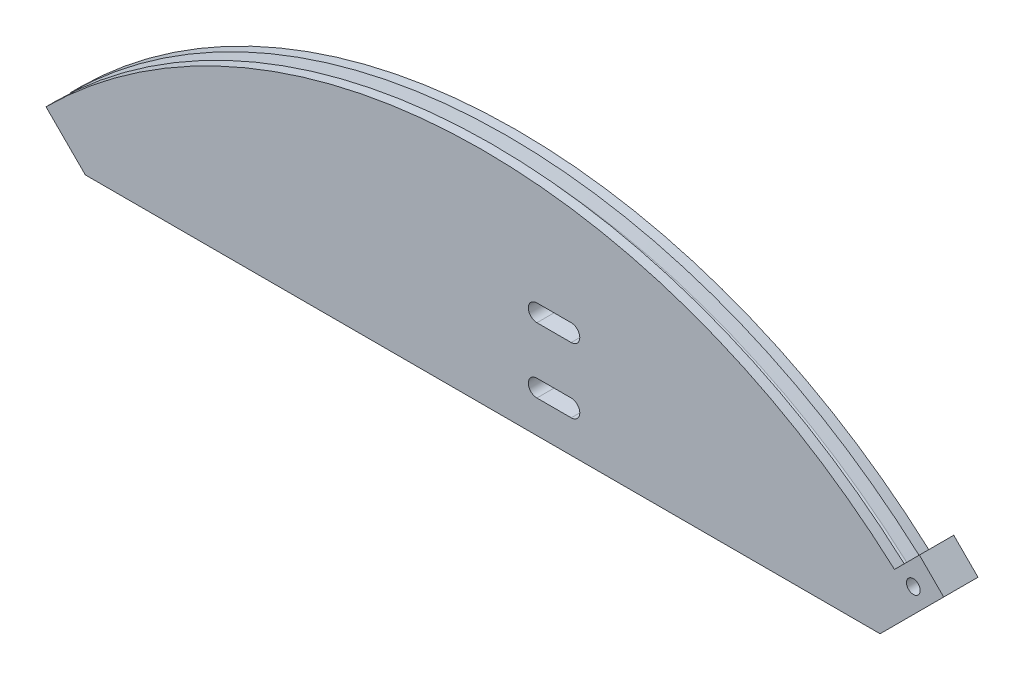
ISO-10303-21;
HEADER;
FILE_DESCRIPTION(('STEP AP214'),'2;1');
FILE_NAME('part.step','',(''),(''),'','','');
FILE_SCHEMA(('AUTOMOTIVE_DESIGN { 1 0 10303 214 1 1 1 1 }'));
ENDSEC;
DATA;
#1=APPLICATION_CONTEXT('core data for automotive mechanical design processes');
#2=APPLICATION_PROTOCOL_DEFINITION('international standard','automotive_design',2000,#1);
#3=PRODUCT_CONTEXT('',#1,'mechanical');
#4=PRODUCT('Part','Part','',(#3));
#5=PRODUCT_RELATED_PRODUCT_CATEGORY('part','',(#4));
#6=PRODUCT_DEFINITION_FORMATION('','',#4);
#7=PRODUCT_DEFINITION_CONTEXT('part definition',#1,'design');
#8=PRODUCT_DEFINITION('design','',#6,#7);
#9=PRODUCT_DEFINITION_SHAPE('','',#8);
#10=(LENGTH_UNIT() NAMED_UNIT(*) SI_UNIT(.MILLI.,.METRE.));
#11=(NAMED_UNIT(*) PLANE_ANGLE_UNIT() SI_UNIT($,.RADIAN.));
#12=(NAMED_UNIT(*) SI_UNIT($,.STERADIAN.) SOLID_ANGLE_UNIT());
#13=UNCERTAINTY_MEASURE_WITH_UNIT(LENGTH_MEASURE(1.E-05),#10,'distance_accuracy_value','');
#14=(GEOMETRIC_REPRESENTATION_CONTEXT(3) GLOBAL_UNCERTAINTY_ASSIGNED_CONTEXT((#13)) GLOBAL_UNIT_ASSIGNED_CONTEXT((#10,
#11,#12)) REPRESENTATION_CONTEXT('',''));
#15=CARTESIAN_POINT('',(0.,0.,0.));
#16=DIRECTION('',(0.,0.,1.));
#17=DIRECTION('',(1.,0.,0.));
#18=AXIS2_PLACEMENT_3D('',#15,#16,#17);
#19=CARTESIAN_POINT('',(0.,0.,5.));
#20=DIRECTION('',(0.,0.,-1.));
#21=DIRECTION('',(-1.,0.,0.));
#22=AXIS2_PLACEMENT_3D('',#19,#20,#21);
#23=CYLINDRICAL_SURFACE('',#22,180.);
#24=DIRECTION('',(0.,0.,-1.));
#25=VECTOR('',#24,1.);
#26=CARTESIAN_POINT('',(120.011582459523,134.153718083254,5.));
#27=LINE('',#26,#25);
#28=CARTESIAN_POINT('',(120.011582459523,134.153718083254,-5.));
#29=VERTEX_POINT('',#28);
#30=CARTESIAN_POINT('',(120.011582459523,134.153718083254,-2.15608847527453));
#31=VERTEX_POINT('',#30);
#32=EDGE_CURVE('E300',#29,#31,#27,.F.);
#33=ORIENTED_EDGE('',*,*,#32,.F.);
#34=CARTESIAN_POINT('',(0.,0.,-5.));
#35=DIRECTION('',(0.,0.,-1.));
#36=DIRECTION('',(-1.,0.,0.));
#37=AXIS2_PLACEMENT_3D('',#34,#35,#36);
#38=CIRCLE('',#37,180.);
#39=CARTESIAN_POINT('',(-127.279220613579,127.279220613578,-5.));
#40=VERTEX_POINT('',#39);
#41=EDGE_CURVE('E399',#40,#29,#38,.T.);
#42=ORIENTED_EDGE('',*,*,#41,.F.);
#43=DIRECTION('',(0.,0.,-1.));
#44=VECTOR('',#43,1.);
#45=CARTESIAN_POINT('',(-127.279220613579,127.279220613578,5.));
#46=LINE('',#45,#44);
#47=CARTESIAN_POINT('',(-127.279220613579,127.279220613578,-2.15608847527454));
#48=VERTEX_POINT('',#47);
#49=EDGE_CURVE('E384',#48,#40,#46,.T.);
#50=ORIENTED_EDGE('',*,*,#49,.F.);
#51=CARTESIAN_POINT('',(0.,0.,-2.15608847527454));
#52=DIRECTION('',(0.,0.,-1.));
#53=DIRECTION('',(-1.,0.,0.));
#54=AXIS2_PLACEMENT_3D('',#51,#52,#53);
#55=CIRCLE('',#54,180.);
#56=EDGE_CURVE('E411',#48,#31,#55,.T.);
#57=ORIENTED_EDGE('',*,*,#56,.T.);
#58=EDGE_LOOP('',(#33,#42,#50,#57));
#59=FACE_BOUND('',#58,.T.);
#60=ADVANCED_FACE('F32',(#59),#23,.T.);
#61=CARTESIAN_POINT('',(-120.208152801713,115.814760073381,5.));
#62=DIRECTION('',(0.,1.,0.));
#63=DIRECTION('',(0.,0.,1.));
#64=AXIS2_PLACEMENT_3D('',#61,#62,#63);
#65=PLANE('',#64);
#66=DIRECTION('',(0.,0.,-1.));
#67=VECTOR('',#66,1.);
#68=CARTESIAN_POINT('',(-115.814760073381,115.814760073381,5.));
#69=LINE('',#68,#67);
#70=CARTESIAN_POINT('',(-115.814760073381,115.814760073381,5.));
#71=VERTEX_POINT('',#70);
#72=CARTESIAN_POINT('',(-115.814760073381,115.814760073381,0.499999999999984));
#73=VERTEX_POINT('',#72);
#74=EDGE_CURVE('E234',#71,#73,#69,.T.);
#75=ORIENTED_EDGE('',*,*,#74,.T.);
#76=DIRECTION('',(1.,0.,0.));
#77=VECTOR('',#76,1.);
#78=CARTESIAN_POINT('',(115.814760073381,115.814760073381,0.500000000000028));
#79=LINE('',#78,#77);
#80=CARTESIAN_POINT('',(115.814760073381,115.814760073381,0.50000000000005));
#81=VERTEX_POINT('',#80);
#82=EDGE_CURVE('E344',#73,#81,#79,.T.);
#83=ORIENTED_EDGE('',*,*,#82,.T.);
#84=DIRECTION('',(0.,0.,1.));
#85=VECTOR('',#84,1.);
#86=CARTESIAN_POINT('',(115.814760073381,115.814760073381,5.));
#87=LINE('',#86,#85);
#88=CARTESIAN_POINT('',(115.814760073381,115.814760073381,5.));
#89=VERTEX_POINT('',#88);
#90=EDGE_CURVE('E239',#81,#89,#87,.T.);
#91=ORIENTED_EDGE('',*,*,#90,.T.);
#92=DIRECTION('',(1.,0.,0.));
#93=VECTOR('',#92,1.);
#94=CARTESIAN_POINT('',(-120.208152801713,115.814760073381,5.));
#95=LINE('',#94,#93);
#96=EDGE_CURVE('E346',#71,#89,#95,.T.);
#97=ORIENTED_EDGE('',*,*,#96,.F.);
#98=EDGE_LOOP('',(#75,#83,#91,#97));
#99=FACE_BOUND('',#98,.T.);
#100=ADVANCED_FACE('F331',(#99),#65,.F.);
#101=CARTESIAN_POINT('',(0.,0.,5.));
#102=DIRECTION('',(0.,0.,-1.));
#103=DIRECTION('',(-1.,0.,0.));
#104=AXIS2_PLACEMENT_3D('',#101,#102,#103);
#105=PLANE('',#104);
#106=DIRECTION('',(1.,0.,0.));
#107=VECTOR('',#106,1.);
#108=CARTESIAN_POINT('',(25.7911690817757,130.314760073381,5.));
#109=LINE('',#108,#107);
#110=CARTESIAN_POINT('',(15.7911690817757,130.314760073381,5.));
#111=VERTEX_POINT('',#110);
#112=CARTESIAN_POINT('',(25.7911690817757,130.314760073381,5.));
#113=VERTEX_POINT('',#112);
#114=EDGE_CURVE('E185',#111,#113,#109,.T.);
#115=ORIENTED_EDGE('',*,*,#114,.T.);
#116=CARTESIAN_POINT('',(25.7911690817757,127.814760073381,5.));
#117=DIRECTION('',(0.,0.,-1.));
#118=DIRECTION('',(-1.,0.,0.));
#119=AXIS2_PLACEMENT_3D('',#116,#117,#118);
#120=CIRCLE('',#119,2.5);
#121=CARTESIAN_POINT('',(25.7911690817757,125.314760073381,5.));
#122=VERTEX_POINT('',#121);
#123=EDGE_CURVE('E178',#113,#122,#120,.T.);
#124=ORIENTED_EDGE('',*,*,#123,.T.);
#125=DIRECTION('',(-1.,0.,0.));
#126=VECTOR('',#125,1.);
#127=CARTESIAN_POINT('',(25.7911690817757,125.314760073381,5.));
#128=LINE('',#127,#126);
#129=CARTESIAN_POINT('',(15.7911690817757,125.314760073381,5.));
#130=VERTEX_POINT('',#129);
#131=EDGE_CURVE('E189',#122,#130,#128,.T.);
#132=ORIENTED_EDGE('',*,*,#131,.T.);
#133=CARTESIAN_POINT('',(15.7911690817757,127.814760073381,5.));
#134=DIRECTION('',(0.,0.,-1.));
#135=DIRECTION('',(1.,0.,0.));
#136=AXIS2_PLACEMENT_3D('',#133,#134,#135);
#137=CIRCLE('',#136,2.5);
#138=EDGE_CURVE('E194',#130,#111,#137,.T.);
#139=ORIENTED_EDGE('',*,*,#138,.T.);
#140=EDGE_LOOP('',(#115,#124,#132,#139));
#141=FACE_BOUND('',#140,.T.);
#142=DIRECTION('',(-1.,0.,0.));
#143=VECTOR('',#142,1.);
#144=CARTESIAN_POINT('',(25.7911690817757,144.314760073381,5.));
#145=LINE('',#144,#143);
#146=CARTESIAN_POINT('',(25.7911690817757,144.314760073381,5.));
#147=VERTEX_POINT('',#146);
#148=CARTESIAN_POINT('',(15.7911690817757,144.314760073381,5.));
#149=VERTEX_POINT('',#148);
#150=EDGE_CURVE('E218',#147,#149,#145,.T.);
#151=ORIENTED_EDGE('',*,*,#150,.T.);
#152=CARTESIAN_POINT('',(15.7911690817757,146.814760073381,5.));
#153=DIRECTION('',(0.,0.,-1.));
#154=DIRECTION('',(-1.,0.,0.));
#155=AXIS2_PLACEMENT_3D('',#152,#153,#154);
#156=CIRCLE('',#155,2.5);
#157=CARTESIAN_POINT('',(15.7911690817757,149.314760073381,5.));
#158=VERTEX_POINT('',#157);
#159=EDGE_CURVE('E205',#149,#158,#156,.T.);
#160=ORIENTED_EDGE('',*,*,#159,.T.);
#161=DIRECTION('',(1.,0.,0.));
#162=VECTOR('',#161,1.);
#163=CARTESIAN_POINT('',(25.7911690817757,149.314760073381,5.));
#164=LINE('',#163,#162);
#165=CARTESIAN_POINT('',(25.7911690817757,149.314760073381,5.));
#166=VERTEX_POINT('',#165);
#167=EDGE_CURVE('E212',#158,#166,#164,.T.);
#168=ORIENTED_EDGE('',*,*,#167,.T.);
#169=CARTESIAN_POINT('',(25.7911690817757,146.814760073381,5.));
#170=DIRECTION('',(0.,0.,-1.));
#171=DIRECTION('',(1.,0.,0.));
#172=AXIS2_PLACEMENT_3D('',#169,#170,#171);
#173=CIRCLE('',#172,2.5);
#174=EDGE_CURVE('E215',#166,#147,#173,.T.);
#175=ORIENTED_EDGE('',*,*,#174,.T.);
#176=EDGE_LOOP('',(#151,#160,#168,#175));
#177=FACE_BOUND('',#176,.T.);
#178=DIRECTION('',(-0.707106781186549,0.707106781186546,0.));
#179=VECTOR('',#178,1.);
#180=CARTESIAN_POINT('',(-127.279220613579,127.279220613578,5.));
#181=LINE('',#180,#179);
#182=CARTESIAN_POINT('',(-127.279220613579,127.279220613578,5.));
#183=VERTEX_POINT('',#182);
#184=EDGE_CURVE('E395',#71,#183,#181,.T.);
#185=ORIENTED_EDGE('',*,*,#184,.F.);
#186=ORIENTED_EDGE('',*,*,#96,.T.);
#187=DIRECTION('',(-0.707106781186548,-0.707106781186547,0.));
#188=VECTOR('',#187,1.);
#189=CARTESIAN_POINT('',(127.279220613579,127.279220613578,5.));
#190=LINE('',#189,#188);
#191=CARTESIAN_POINT('',(134.350288425444,134.350288425444,5.));
#192=VERTEX_POINT('',#191);
#193=EDGE_CURVE('E385',#192,#89,#190,.T.);
#194=ORIENTED_EDGE('',*,*,#193,.F.);
#195=DIRECTION('',(0.707106781186547,-0.707106781186547,0.));
#196=VECTOR('',#195,1.);
#197=CARTESIAN_POINT('',(134.350288425444,134.350288425444,5.));
#198=LINE('',#197,#196);
#199=CARTESIAN_POINT('',(127.279220613579,141.421356237309,5.));
#200=VERTEX_POINT('',#199);
#201=EDGE_CURVE('E254',#200,#192,#198,.T.);
#202=ORIENTED_EDGE('',*,*,#201,.F.);
#203=DIRECTION('',(0.707106781186547,0.707106781186548,0.));
#204=VECTOR('',#203,1.);
#205=CARTESIAN_POINT('',(127.279220613579,141.421356237309,5.));
#206=LINE('',#205,#204);
#207=CARTESIAN_POINT('',(120.011582459523,134.153718083254,5.));
#208=VERTEX_POINT('',#207);
#209=EDGE_CURVE('E252',#208,#200,#206,.T.);
#210=ORIENTED_EDGE('',*,*,#209,.F.);
#211=CARTESIAN_POINT('',(0.,0.,5.));
#212=DIRECTION('',(0.,0.,-1.));
#213=DIRECTION('',(-1.,0.,0.));
#214=AXIS2_PLACEMENT_3D('',#211,#212,#213);
#215=CIRCLE('',#214,180.);
#216=EDGE_CURVE('E392',#183,#208,#215,.T.);
#217=ORIENTED_EDGE('',*,*,#216,.F.);
#218=EDGE_LOOP('',(#185,#186,#194,#202,#210,#217));
#219=FACE_BOUND('',#218,.T.);
#220=CARTESIAN_POINT('',(125.511453660612,132.582521472477,5.));
#221=DIRECTION('',(0.,0.,-1.));
#222=DIRECTION('',(-1.,0.,0.));
#223=AXIS2_PLACEMENT_3D('',#220,#221,#222);
#224=CIRCLE('',#223,2.);
#225=CARTESIAN_POINT('',(123.511453660612,132.582521472477,5.));
#226=VERTEX_POINT('',#225);
#227=EDGE_CURVE('E249',#226,#226,#224,.T.);
#228=ORIENTED_EDGE('',*,*,#227,.T.);
#229=EDGE_LOOP('',(#228));
#230=FACE_BOUND('',#229,.T.);
#231=ADVANCED_FACE('F196',(#141,#177,#219,#230),#105,.F.);
#232=CARTESIAN_POINT('',(0.,0.,0.));
#233=DIRECTION('',(0.,0.,-1.));
#234=DIRECTION('',(-1.,0.,0.));
#235=AXIS2_PLACEMENT_3D('',#232,#233,#234);
#236=PLANE('',#235);
#237=CARTESIAN_POINT('',(25.7911690817757,127.814760073381,0.));
#238=DIRECTION('',(0.,0.,-1.));
#239=DIRECTION('',(-1.,0.,0.));
#240=AXIS2_PLACEMENT_3D('',#237,#238,#239);
#241=CIRCLE('',#240,2.5);
#242=CARTESIAN_POINT('',(25.7911690817757,130.314760073381,0.));
#243=VERTEX_POINT('',#242);
#244=CARTESIAN_POINT('',(25.7911690817757,125.314760073381,0.));
#245=VERTEX_POINT('',#244);
#246=EDGE_CURVE('E181',#243,#245,#241,.T.);
#247=ORIENTED_EDGE('',*,*,#246,.F.);
#248=DIRECTION('',(1.,0.,0.));
#249=VECTOR('',#248,1.);
#250=CARTESIAN_POINT('',(0.,130.314760073381,0.));
#251=LINE('',#250,#249);
#252=CARTESIAN_POINT('',(15.7911690817757,130.314760073381,0.));
#253=VERTEX_POINT('',#252);
#254=EDGE_CURVE('E352',#253,#243,#251,.T.);
#255=ORIENTED_EDGE('',*,*,#254,.F.);
#256=CARTESIAN_POINT('',(15.7911690817757,127.814760073381,0.));
#257=DIRECTION('',(0.,0.,-1.));
#258=DIRECTION('',(-1.,0.,0.));
#259=AXIS2_PLACEMENT_3D('',#256,#257,#258);
#260=CIRCLE('',#259,2.5);
#261=CARTESIAN_POINT('',(15.7911690817757,125.314760073381,0.));
#262=VERTEX_POINT('',#261);
#263=EDGE_CURVE('E356',#262,#253,#260,.T.);
#264=ORIENTED_EDGE('',*,*,#263,.F.);
#265=DIRECTION('',(-1.,0.,0.));
#266=VECTOR('',#265,1.);
#267=CARTESIAN_POINT('',(0.,125.314760073381,0.));
#268=LINE('',#267,#266);
#269=EDGE_CURVE('E358',#245,#262,#268,.T.);
#270=ORIENTED_EDGE('',*,*,#269,.F.);
#271=EDGE_LOOP('',(#247,#255,#264,#270));
#272=FACE_BOUND('',#271,.T.);
#273=CARTESIAN_POINT('',(15.7911690817757,146.814760073381,0.));
#274=DIRECTION('',(0.,0.,-1.));
#275=DIRECTION('',(-1.,0.,0.));
#276=AXIS2_PLACEMENT_3D('',#273,#274,#275);
#277=CIRCLE('',#276,2.5);
#278=CARTESIAN_POINT('',(15.7911690817757,144.314760073381,0.));
#279=VERTEX_POINT('',#278);
#280=CARTESIAN_POINT('',(15.7911690817757,149.314760073381,0.));
#281=VERTEX_POINT('',#280);
#282=EDGE_CURVE('E360',#279,#281,#277,.T.);
#283=ORIENTED_EDGE('',*,*,#282,.F.);
#284=DIRECTION('',(-1.,0.,0.));
#285=VECTOR('',#284,1.);
#286=CARTESIAN_POINT('',(0.,144.314760073381,0.));
#287=LINE('',#286,#285);
#288=CARTESIAN_POINT('',(25.7911690817757,144.314760073381,0.));
#289=VERTEX_POINT('',#288);
#290=EDGE_CURVE('E363',#289,#279,#287,.T.);
#291=ORIENTED_EDGE('',*,*,#290,.F.);
#292=CARTESIAN_POINT('',(25.7911690817757,146.814760073381,0.));
#293=DIRECTION('',(0.,0.,-1.));
#294=DIRECTION('',(-1.,0.,0.));
#295=AXIS2_PLACEMENT_3D('',#292,#293,#294);
#296=CIRCLE('',#295,2.5);
#297=CARTESIAN_POINT('',(25.7911690817757,149.314760073381,0.));
#298=VERTEX_POINT('',#297);
#299=EDGE_CURVE('E365',#298,#289,#296,.T.);
#300=ORIENTED_EDGE('',*,*,#299,.F.);
#301=DIRECTION('',(1.,0.,0.));
#302=VECTOR('',#301,1.);
#303=CARTESIAN_POINT('',(0.,149.314760073381,0.));
#304=LINE('',#303,#302);
#305=EDGE_CURVE('E366',#281,#298,#304,.T.);
#306=ORIENTED_EDGE('',*,*,#305,.F.);
#307=EDGE_LOOP('',(#283,#291,#300,#306));
#308=FACE_BOUND('',#307,.T.);
#309=DIRECTION('',(0.707106781186548,0.707106781186547,0.));
#310=VECTOR('',#309,1.);
#311=CARTESIAN_POINT('',(0.,0.,0.));
#312=LINE('',#311,#310);
#313=CARTESIAN_POINT('',(116.314760073381,116.314760073381,0.));
#314=VERTEX_POINT('',#313);
#315=CARTESIAN_POINT('',(120.208152801713,120.208152801713,0.));
#316=VERTEX_POINT('',#315);
#317=EDGE_CURVE('E237',#314,#316,#312,.T.);
#318=ORIENTED_EDGE('',*,*,#317,.F.);
#319=DIRECTION('',(-1.,0.,0.));
#320=VECTOR('',#319,1.);
#321=CARTESIAN_POINT('',(-115.814760073381,116.314760073381,0.));
#322=LINE('',#321,#320);
#323=CARTESIAN_POINT('',(-116.314760073381,116.314760073381,0.));
#324=VERTEX_POINT('',#323);
#325=EDGE_CURVE('E40',#314,#324,#322,.T.);
#326=ORIENTED_EDGE('',*,*,#325,.T.);
#327=DIRECTION('',(0.707106781186546,-0.707106781186549,0.));
#328=VECTOR('',#327,1.);
#329=CARTESIAN_POINT('',(-4.51401581871586E-13,-4.51401581871585E-13,0.));
#330=LINE('',#329,#328);
#331=CARTESIAN_POINT('',(-120.208152801713,120.208152801713,0.));
#332=VERTEX_POINT('',#331);
#333=EDGE_CURVE('E225',#332,#324,#330,.T.);
#334=ORIENTED_EDGE('',*,*,#333,.F.);
#335=CARTESIAN_POINT('',(0.,0.,0.));
#336=DIRECTION('',(0.,0.,1.));
#337=DIRECTION('',(-1.,0.,0.));
#338=AXIS2_PLACEMENT_3D('',#335,#336,#337);
#339=CIRCLE('',#338,170.);
#340=EDGE_CURVE('E375',#316,#332,#339,.T.);
#341=ORIENTED_EDGE('',*,*,#340,.F.);
#342=EDGE_LOOP('',(#318,#326,#334,#341));
#343=FACE_BOUND('',#342,.T.);
#344=ADVANCED_FACE('F327',(#272,#308,#343),#236,.T.);
#345=CARTESIAN_POINT('',(0.,0.,5.));
#346=DIRECTION('',(0.,0.,-1.));
#347=DIRECTION('',(-1.,0.,0.));
#348=AXIS2_PLACEMENT_3D('',#345,#346,#347);
#349=CYLINDRICAL_SURFACE('',#348,170.);
#350=DIRECTION('',(0.,0.,-1.));
#351=VECTOR('',#350,1.);
#352=CARTESIAN_POINT('',(120.208152801713,120.208152801713,5.));
#353=LINE('',#352,#351);
#354=CARTESIAN_POINT('',(120.208152801713,120.208152801713,-5.));
#355=VERTEX_POINT('',#354);
#356=EDGE_CURVE('E380',#316,#355,#353,.T.);
#357=ORIENTED_EDGE('',*,*,#356,.F.);
#358=ORIENTED_EDGE('',*,*,#340,.T.);
#359=DIRECTION('',(0.,0.,-1.));
#360=VECTOR('',#359,1.);
#361=CARTESIAN_POINT('',(-120.208152801713,120.208152801713,5.));
#362=LINE('',#361,#360);
#363=CARTESIAN_POINT('',(-120.208152801713,120.208152801713,-5.));
#364=VERTEX_POINT('',#363);
#365=EDGE_CURVE('E382',#332,#364,#362,.T.);
#366=ORIENTED_EDGE('',*,*,#365,.T.);
#367=CARTESIAN_POINT('',(0.,0.,-5.));
#368=DIRECTION('',(0.,0.,1.));
#369=DIRECTION('',(-1.,0.,0.));
#370=AXIS2_PLACEMENT_3D('',#367,#368,#369);
#371=CIRCLE('',#370,170.);
#372=EDGE_CURVE('E405',#355,#364,#371,.T.);
#373=ORIENTED_EDGE('',*,*,#372,.F.);
#374=EDGE_LOOP('',(#357,#358,#366,#373));
#375=FACE_BOUND('',#374,.T.);
#376=ADVANCED_FACE('F318',(#375),#349,.F.);
#377=CARTESIAN_POINT('',(127.279220613579,127.279220613578,5.));
#378=DIRECTION('',(0.707106781186547,-0.707106781186548,0.));
#379=DIRECTION('',(0.707106781186548,0.707106781186547,0.));
#380=AXIS2_PLACEMENT_3D('',#377,#378,#379);
#381=PLANE('',#380);
#382=ORIENTED_EDGE('',*,*,#90,.F.);
#383=DIRECTION('',(0.577350269189616,0.577350269189615,-0.577350269189647));
#384=VECTOR('',#383,1.);
#385=CARTESIAN_POINT('',(121.957733766846,121.957733766846,-5.642973693465));
#386=LINE('',#385,#384);
#387=EDGE_CURVE('E54',#81,#314,#386,.T.);
#388=ORIENTED_EDGE('',*,*,#387,.T.);
#389=ORIENTED_EDGE('',*,*,#317,.T.);
#390=ORIENTED_EDGE('',*,*,#356,.T.);
#391=DIRECTION('',(-0.707106781186548,-0.707106781186547,0.));
#392=VECTOR('',#391,1.);
#393=CARTESIAN_POINT('',(127.279220613579,127.279220613578,-5.));
#394=LINE('',#393,#392);
#395=CARTESIAN_POINT('',(134.350288425444,134.350288425444,-5.));
#396=VERTEX_POINT('',#395);
#397=EDGE_CURVE('E397',#396,#355,#394,.T.);
#398=ORIENTED_EDGE('',*,*,#397,.F.);
#399=DIRECTION('',(0.,0.,-1.));
#400=VECTOR('',#399,1.);
#401=CARTESIAN_POINT('',(134.350288425444,134.350288425444,5.));
#402=LINE('',#401,#400);
#403=EDGE_CURVE('E258',#192,#396,#402,.T.);
#404=ORIENTED_EDGE('',*,*,#403,.F.);
#405=ORIENTED_EDGE('',*,*,#193,.T.);
#406=EDGE_LOOP('',(#382,#388,#389,#390,#398,#404,#405));
#407=FACE_BOUND('',#406,.T.);
#408=ADVANCED_FACE('F314',(#407),#381,.T.);
#409=DIRECTION('',(0.,0.,-1.));
#410=VECTOR('',#409,1.);
#411=CARTESIAN_POINT('',(120.011582459523,134.153718083254,5.));
#412=LINE('',#411,#410);
#413=CARTESIAN_POINT('',(120.011582459523,134.153718083254,2.15608847527453));
#414=VERTEX_POINT('',#413);
#415=EDGE_CURVE('E271',#414,#208,#412,.F.);
#416=ORIENTED_EDGE('',*,*,#415,.F.);
#417=CARTESIAN_POINT('',(0.,0.,2.15608847527454));
#418=DIRECTION('',(0.,0.,-1.));
#419=DIRECTION('',(-1.,0.,0.));
#420=AXIS2_PLACEMENT_3D('',#417,#418,#419);
#421=CIRCLE('',#420,180.);
#422=CARTESIAN_POINT('',(-127.279220613579,127.279220613578,2.15608847527454));
#423=VERTEX_POINT('',#422);
#424=EDGE_CURVE('E414',#423,#414,#421,.T.);
#425=ORIENTED_EDGE('',*,*,#424,.F.);
#426=EDGE_CURVE('E386',#183,#423,#46,.T.);
#427=ORIENTED_EDGE('',*,*,#426,.F.);
#428=ORIENTED_EDGE('',*,*,#216,.T.);
#429=EDGE_LOOP('',(#416,#425,#427,#428));
#430=FACE_BOUND('',#429,.T.);
#431=ADVANCED_FACE('F317',(#430),#23,.T.);
#432=CARTESIAN_POINT('',(-127.279220613579,127.279220613578,5.));
#433=DIRECTION('',(-0.707106781186546,-0.707106781186549,0.));
#434=DIRECTION('',(0.707106781186549,-0.707106781186546,0.));
#435=AXIS2_PLACEMENT_3D('',#432,#433,#434);
#436=PLANE('',#435);
#437=ORIENTED_EDGE('',*,*,#333,.T.);
#438=DIRECTION('',(0.577350269189617,-0.577350269189614,0.577350269189646));
#439=VECTOR('',#438,1.);
#440=CARTESIAN_POINT('',(-121.957733766846,121.957733766846,-5.64297369346503));
#441=LINE('',#440,#439);
#442=EDGE_CURVE('E11',#324,#73,#441,.T.);
#443=ORIENTED_EDGE('',*,*,#442,.T.);
#444=ORIENTED_EDGE('',*,*,#74,.F.);
#445=ORIENTED_EDGE('',*,*,#184,.T.);
#446=ORIENTED_EDGE('',*,*,#426,.T.);
#447=DIRECTION('',(0.664463024388677,-0.664463024388672,-0.342020143325671));
#448=VECTOR('',#447,1.);
#449=CARTESIAN_POINT('',(-124.916055507371,124.916055507371,0.939692620785907));
#450=LINE('',#449,#448);
#451=CARTESIAN_POINT('',(-124.916055507371,124.916055507371,0.939692620785859));
#452=VERTEX_POINT('',#451);
#453=EDGE_CURVE('E418',#423,#452,#450,.T.);
#454=ORIENTED_EDGE('',*,*,#453,.T.);
#455=CARTESIAN_POINT('',(-125.157900270019,125.157900270019,0.));
#456=DIRECTION('',(0.707106781186545,0.70710678118655,0.));
#457=DIRECTION('',(-0.70710678118655,0.707106781186545,0.));
#458=AXIS2_PLACEMENT_3D('',#455,#456,#457);
#459=CIRCLE('',#458,1.);
#460=CARTESIAN_POINT('',(-124.916055507371,124.916055507371,-0.939692620785907));
#461=VERTEX_POINT('',#460);
#462=EDGE_CURVE('E423',#452,#461,#459,.T.);
#463=ORIENTED_EDGE('',*,*,#462,.T.);
#464=DIRECTION('',(-0.664463024388677,0.664463024388672,-0.342020143325671));
#465=VECTOR('',#464,1.);
#466=CARTESIAN_POINT('',(-124.916055507371,124.916055507371,-0.939692620785907));
#467=LINE('',#466,#465);
#468=EDGE_CURVE('E421',#461,#48,#467,.T.);
#469=ORIENTED_EDGE('',*,*,#468,.T.);
#470=ORIENTED_EDGE('',*,*,#49,.T.);
#471=DIRECTION('',(-0.707106781186549,0.707106781186546,0.));
#472=VECTOR('',#471,1.);
#473=CARTESIAN_POINT('',(-127.279220613579,127.279220613578,-5.));
#474=LINE('',#473,#472);
#475=EDGE_CURVE('E402',#364,#40,#474,.T.);
#476=ORIENTED_EDGE('',*,*,#475,.F.);
#477=ORIENTED_EDGE('',*,*,#365,.F.);
#478=EDGE_LOOP('',(#437,#443,#444,#445,#446,#454,#463,#469,#470,#476,#477));
#479=FACE_BOUND('',#478,.T.);
#480=ADVANCED_FACE('F312',(#479),#436,.T.);
#481=CARTESIAN_POINT('',(0.,0.,-5.));
#482=DIRECTION('',(0.,0.,-1.));
#483=DIRECTION('',(-1.,0.,0.));
#484=AXIS2_PLACEMENT_3D('',#481,#482,#483);
#485=PLANE('',#484);
#486=ORIENTED_EDGE('',*,*,#397,.T.);
#487=ORIENTED_EDGE('',*,*,#372,.T.);
#488=ORIENTED_EDGE('',*,*,#475,.T.);
#489=ORIENTED_EDGE('',*,*,#41,.T.);
#490=DIRECTION('',(0.707106781186547,0.707106781186548,0.));
#491=VECTOR('',#490,1.);
#492=CARTESIAN_POINT('',(127.279220613579,141.421356237309,-5.));
#493=LINE('',#492,#491);
#494=CARTESIAN_POINT('',(127.279220613579,141.421356237309,-5.));
#495=VERTEX_POINT('',#494);
#496=EDGE_CURVE('E244',#29,#495,#493,.T.);
#497=ORIENTED_EDGE('',*,*,#496,.T.);
#498=DIRECTION('',(0.707106781186547,-0.707106781186547,0.));
#499=VECTOR('',#498,1.);
#500=CARTESIAN_POINT('',(134.350288425444,134.350288425444,-5.));
#501=LINE('',#500,#499);
#502=EDGE_CURVE('E246',#495,#396,#501,.T.);
#503=ORIENTED_EDGE('',*,*,#502,.T.);
#504=EDGE_LOOP('',(#486,#487,#488,#489,#497,#503));
#505=FACE_BOUND('',#504,.T.);
#506=CARTESIAN_POINT('',(125.511453660612,132.582521472477,-5.));
#507=DIRECTION('',(0.,0.,-1.));
#508=DIRECTION('',(-1.,0.,0.));
#509=AXIS2_PLACEMENT_3D('',#506,#507,#508);
#510=CIRCLE('',#509,2.);
#511=CARTESIAN_POINT('',(123.511453660612,132.582521472477,-5.));
#512=VERTEX_POINT('',#511);
#513=EDGE_CURVE('E241',#512,#512,#510,.T.);
#514=ORIENTED_EDGE('',*,*,#513,.F.);
#515=EDGE_LOOP('',(#514));
#516=FACE_BOUND('',#515,.T.);
#517=ADVANCED_FACE('F309',(#505,#516),#485,.T.);
#518=CARTESIAN_POINT('',(0.,0.,0.));
#519=DIRECTION('',(0.,0.,-1.));
#520=DIRECTION('',(-1.,0.,0.));
#521=AXIS2_PLACEMENT_3D('',#518,#519,#520);
#522=TOROIDAL_SURFACE('',#521,177.,1.);
#523=CARTESIAN_POINT('',(0.,0.,0.939692620785907));
#524=DIRECTION('',(0.,0.,-1.));
#525=DIRECTION('',(-1.,0.,0.));
#526=AXIS2_PLACEMENT_3D('',#523,#524,#525);
#527=CIRCLE('',#526,176.657979856674);
#528=CARTESIAN_POINT('',(117.644692713902,131.786828337633,0.939692620785907));
#529=VERTEX_POINT('',#528);
#530=EDGE_CURVE('E416',#452,#529,#527,.T.);
#531=ORIENTED_EDGE('',*,*,#530,.T.);
#532=CARTESIAN_POINT('',(117.736189385021,131.878325008751,0.977088887740852));
#533=CARTESIAN_POINT('',(117.720743711273,131.862879335003,0.972337446076096));
#534=CARTESIAN_POINT('',(117.70541715424,131.84755277797,0.966859335297035));
#535=CARTESIAN_POINT('',(117.675029324941,131.817164948672,0.954457009780921));
#536=CARTESIAN_POINT('',(117.659968584641,131.802104208372,0.947530188480028));
#537=CARTESIAN_POINT('',(117.607695170556,131.749830794286,0.920710853752846));
#538=CARTESIAN_POINT('',(117.571408150486,131.713543774217,0.897045952447444));
#539=CARTESIAN_POINT('',(117.502134252597,131.644269876328,0.841423904502413));
#540=CARTESIAN_POINT('',(117.469151517007,131.611287140738,0.809456525811238));
#541=CARTESIAN_POINT('',(117.407460771669,131.549596395399,0.738149931253692));
#542=CARTESIAN_POINT('',(117.378750886905,131.520886510635,0.698813966093187));
#543=CARTESIAN_POINT('',(117.326423304531,131.468558928261,0.613887424252139));
#544=CARTESIAN_POINT('',(117.302804365015,131.444939988745,0.568298377423894));
#545=CARTESIAN_POINT('',(117.261345496523,131.403481120253,0.472200144939431));
#546=CARTESIAN_POINT('',(117.243499720927,131.385635344657,0.421696004789447));
#547=CARTESIAN_POINT('',(117.214066293569,131.3562019173,0.317161663553523));
#548=CARTESIAN_POINT('',(117.202478799558,131.344614423289,0.263131373623646));
#549=CARTESIAN_POINT('',(117.185907568773,131.328043192503,0.153163711140857));
#550=CARTESIAN_POINT('',(117.180914324772,131.323049948502,0.0972292036822494));
#551=CARTESIAN_POINT('',(117.177643851616,131.319779475347,-0.0150316569611994));
#552=CARTESIAN_POINT('',(117.179366666525,131.321502290255,-0.0713580127144703));
#553=CARTESIAN_POINT('',(117.189475667336,131.331611291066,-0.182765033555946));
#554=CARTESIAN_POINT('',(117.197857601848,131.339993225579,-0.23784647037211));
#555=CARTESIAN_POINT('',(117.221038408929,131.363174032659,-0.345233103150092));
#556=CARTESIAN_POINT('',(117.235836653165,131.377972276895,-0.397538570392143));
#557=CARTESIAN_POINT('',(117.271428974139,131.413564597869,-0.497905433094977));
#558=CARTESIAN_POINT('',(117.29222394298,131.43435956671,-0.54596619570147));
#559=CARTESIAN_POINT('',(117.339230209192,131.481365832922,-0.636502316631662));
#560=CARTESIAN_POINT('',(117.365444367658,131.507579991388,-0.678974705075093));
#561=CARTESIAN_POINT('',(117.422590116493,131.564725740223,-0.757187916302949));
#562=CARTESIAN_POINT('',(117.45353175251,131.59566737624,-0.792914033335121));
#563=CARTESIAN_POINT('',(117.519161821393,131.661297445123,-0.856451482272249));
#564=CARTESIAN_POINT('',(117.553841326431,131.695976950161,-0.88428112103348));
#565=CARTESIAN_POINT('',(117.607953068897,131.750088692627,-0.919588025912723));
#566=CARTESIAN_POINT('',(117.626369502201,131.768505125932,-0.930295745185527));
#567=CARTESIAN_POINT('',(117.682525913384,131.824661537115,-0.959095697818133));
#568=CARTESIAN_POINT('',(117.721155970288,131.863291594018,-0.973851081195405));
#569=CARTESIAN_POINT('',(117.799666286683,131.941801910414,-0.993980922150626));
#570=CARTESIAN_POINT('',(117.839547905156,131.981683528886,-0.999344796228181));
#571=CARTESIAN_POINT('',(117.893531356586,132.035666980317,-1.00015586628561));
#572=CARTESIAN_POINT('',(117.907642708815,132.049778332545,-0.999770920045031));
#573=CARTESIAN_POINT('',(117.93578357875,132.077919202481,-0.997814936710401));
#574=CARTESIAN_POINT('',(117.949813215094,132.091948838824,-0.996247314563025));
#575=CARTESIAN_POINT('',(117.963803196566,132.105938820296,-0.994091159150351));
#576=B_SPLINE_CURVE_WITH_KNOTS('',3,(#532,#533,#534,#535,#536,#537,#538,#539,#540,#541,#542,
#543,#544,#545,#546,#547,#548,#549,#550,#551,#552,#553,#554,#555,#556,#557,#558,#559,#560,#561,
#562,#563,#564,#565,#566,#567,#568,#569,#570,#571,#572,#573,#574,#575),.UNSPECIFIED.,.F.,.F.,(4,
2,2,2,2,2,2,2,2,2,2,2,2,2,2,2,2,2,2,2,2,4),(0.,0.0670300250693148,0.134181706404661,
0.302833292476237,0.471693720863738,0.640479829928815,0.809224717917413,0.977798175049171,
1.14637588115418,1.31471027491706,1.48304577309525,1.65127388690369,1.81948553031732,
1.98772221066412,2.15604794051112,2.32473646063794,2.49303064412905,2.57744209012514,
2.74634700974852,2.91544214986125,2.97529536297636,3.03497640977476),.UNSPECIFIED.);
#577=CARTESIAN_POINT('',(117.644692713902,131.786828337633,-0.939692620785893));
#578=VERTEX_POINT('',#577);
#579=EDGE_CURVE('E261',#529,#578,#576,.T.);
#580=ORIENTED_EDGE('',*,*,#579,.T.);
#581=CARTESIAN_POINT('',(0.,0.,-0.939692620785907));
#582=DIRECTION('',(0.,0.,-1.));
#583=DIRECTION('',(-1.,0.,0.));
#584=AXIS2_PLACEMENT_3D('',#581,#582,#583);
#585=CIRCLE('',#584,176.657979856674);
#586=EDGE_CURVE('E408',#461,#578,#585,.T.);
#587=ORIENTED_EDGE('',*,*,#586,.F.);
#588=ORIENTED_EDGE('',*,*,#462,.F.);
#589=EDGE_LOOP('',(#531,#580,#587,#588));
#590=FACE_BOUND('',#589,.T.);
#591=ADVANCED_FACE('F273',(#590),#522,.F.);
#592=CARTESIAN_POINT('',(0.,0.,-0.939692620785907));
#593=DIRECTION('',(0.,0.,-1.));
#594=DIRECTION('',(-1.,0.,0.));
#595=AXIS2_PLACEMENT_3D('',#592,#593,#594);
#596=CONICAL_SURFACE('',#595,176.657979856674,1.22173047639603);
#597=ORIENTED_EDGE('',*,*,#586,.T.);
#598=CARTESIAN_POINT('',(117.644303537898,131.786439161629,-0.939492620785907));
#599=CARTESIAN_POINT('',(118.038916244884,132.181051868614,-1.14228663249949));
#600=CARTESIAN_POINT('',(118.433528271261,132.575663894991,-1.34508329289702));
#601=CARTESIAN_POINT('',(119.222750962799,133.364886586529,-1.75068191105991));
#602=CARTESIAN_POINT('',(119.61736162796,133.75949725169,-1.95348386882526));
#603=CARTESIAN_POINT('',(120.011971612513,134.154107236243,-2.15628847527456));
#604=B_SPLINE_CURVE_WITH_KNOTS('',3,(#598,#599,#600,#601,#602,#603),.UNSPECIFIED.,.F.,.F.,(4,2,
4),(0.,1.78131246380947,3.56262492761818),.UNSPECIFIED.);
#605=EDGE_CURVE('E293',#578,#31,#604,.T.);
#606=ORIENTED_EDGE('',*,*,#605,.T.);
#607=ORIENTED_EDGE('',*,*,#56,.F.);
#608=ORIENTED_EDGE('',*,*,#468,.F.);
#609=EDGE_LOOP('',(#597,#606,#607,#608));
#610=FACE_BOUND('',#609,.T.);
#611=ADVANCED_FACE('F302',(#610),#596,.T.);
#612=CARTESIAN_POINT('',(0.,0.,2.15608847527454));
#613=DIRECTION('',(0.,0.,1.));
#614=DIRECTION('',(1.,0.,0.));
#615=AXIS2_PLACEMENT_3D('',#612,#613,#614);
#616=CONICAL_SURFACE('',#615,180.,1.22173047639603);
#617=ORIENTED_EDGE('',*,*,#424,.T.);
#618=CARTESIAN_POINT('',(120.011971612513,134.154107236243,2.15628847527455));
#619=CARTESIAN_POINT('',(119.61736162796,133.75949725169,1.95348386882525));
#620=CARTESIAN_POINT('',(119.222750962799,133.364886586529,1.75068191105991));
#621=CARTESIAN_POINT('',(118.433528271261,132.575663894991,1.34508329289702));
#622=CARTESIAN_POINT('',(118.038916244884,132.181051868614,1.14228663249949));
#623=CARTESIAN_POINT('',(117.644303537898,131.786439161629,0.939492620785907));
#624=B_SPLINE_CURVE_WITH_KNOTS('',3,(#618,#619,#620,#621,#622,#623),.UNSPECIFIED.,.F.,.F.,(4,2,
4),(0.,1.78131246380871,3.56262492761818),.UNSPECIFIED.);
#625=EDGE_CURVE('E287',#414,#529,#624,.T.);
#626=ORIENTED_EDGE('',*,*,#625,.T.);
#627=ORIENTED_EDGE('',*,*,#530,.F.);
#628=ORIENTED_EDGE('',*,*,#453,.F.);
#629=EDGE_LOOP('',(#617,#626,#627,#628));
#630=FACE_BOUND('',#629,.T.);
#631=ADVANCED_FACE('F306',(#630),#616,.T.);
#632=CARTESIAN_POINT('',(134.350288425444,134.350288425444,5.));
#633=DIRECTION('',(0.707106781186548,0.707106781186548,0.));
#634=DIRECTION('',(-0.707106781186548,0.707106781186548,0.));
#635=AXIS2_PLACEMENT_3D('',#632,#633,#634);
#636=PLANE('',#635);
#637=ORIENTED_EDGE('',*,*,#403,.T.);
#638=ORIENTED_EDGE('',*,*,#502,.F.);
#639=DIRECTION('',(0.,0.,-1.));
#640=VECTOR('',#639,1.);
#641=CARTESIAN_POINT('',(127.279220613579,141.421356237309,5.));
#642=LINE('',#641,#640);
#643=EDGE_CURVE('E257',#200,#495,#642,.T.);
#644=ORIENTED_EDGE('',*,*,#643,.F.);
#645=ORIENTED_EDGE('',*,*,#201,.T.);
#646=EDGE_LOOP('',(#637,#638,#644,#645));
#647=FACE_BOUND('',#646,.T.);
#648=ADVANCED_FACE('F281',(#647),#636,.T.);
#649=CARTESIAN_POINT('',(127.279220613579,141.421356237309,5.));
#650=DIRECTION('',(-0.707106781186548,0.707106781186547,0.));
#651=DIRECTION('',(-0.707106781186547,-0.707106781186548,0.));
#652=AXIS2_PLACEMENT_3D('',#649,#650,#651);
#653=PLANE('',#652);
#654=ORIENTED_EDGE('',*,*,#496,.F.);
#655=ORIENTED_EDGE('',*,*,#32,.T.);
#656=ORIENTED_EDGE('',*,*,#605,.F.);
#657=ORIENTED_EDGE('',*,*,#579,.F.);
#658=ORIENTED_EDGE('',*,*,#625,.F.);
#659=ORIENTED_EDGE('',*,*,#415,.T.);
#660=ORIENTED_EDGE('',*,*,#209,.T.);
#661=ORIENTED_EDGE('',*,*,#643,.T.);
#662=EDGE_LOOP('',(#654,#655,#656,#657,#658,#659,#660,#661));
#663=FACE_BOUND('',#662,.T.);
#664=ADVANCED_FACE('F276',(#663),#653,.T.);
#665=CARTESIAN_POINT('',(125.511453660612,132.582521472477,5.));
#666=DIRECTION('',(0.,0.,-1.));
#667=DIRECTION('',(-1.,0.,0.));
#668=AXIS2_PLACEMENT_3D('',#665,#666,#667);
#669=CYLINDRICAL_SURFACE('',#668,2.);
#670=ORIENTED_EDGE('',*,*,#227,.F.);
#671=EDGE_LOOP('',(#670));
#672=FACE_BOUND('',#671,.T.);
#673=ORIENTED_EDGE('',*,*,#513,.T.);
#674=EDGE_LOOP('',(#673));
#675=FACE_BOUND('',#674,.T.);
#676=ADVANCED_FACE('F280',(#672,#675),#669,.F.);
#677=CARTESIAN_POINT('',(15.7911690817757,146.814760073381,5.));
#678=DIRECTION('',(0.,0.,-1.));
#679=DIRECTION('',(-1.,0.,0.));
#680=AXIS2_PLACEMENT_3D('',#677,#678,#679);
#681=CYLINDRICAL_SURFACE('',#680,2.5);
#682=ORIENTED_EDGE('',*,*,#282,.T.);
#683=DIRECTION('',(0.,0.,-1.));
#684=VECTOR('',#683,1.);
#685=CARTESIAN_POINT('',(15.7911690817757,149.314760073381,5.));
#686=LINE('',#685,#684);
#687=EDGE_CURVE('E221',#158,#281,#686,.T.);
#688=ORIENTED_EDGE('',*,*,#687,.F.);
#689=ORIENTED_EDGE('',*,*,#159,.F.);
#690=DIRECTION('',(0.,0.,-1.));
#691=VECTOR('',#690,1.);
#692=CARTESIAN_POINT('',(15.7911690817757,144.314760073381,5.));
#693=LINE('',#692,#691);
#694=EDGE_CURVE('E222',#149,#279,#693,.T.);
#695=ORIENTED_EDGE('',*,*,#694,.T.);
#696=EDGE_LOOP('',(#682,#688,#689,#695));
#697=FACE_BOUND('',#696,.T.);
#698=ADVANCED_FACE('F476',(#697),#681,.F.);
#699=CARTESIAN_POINT('',(25.7911690817757,144.314760073381,5.));
#700=DIRECTION('',(0.,-1.,0.));
#701=DIRECTION('',(0.,0.,-1.));
#702=AXIS2_PLACEMENT_3D('',#699,#700,#701);
#703=PLANE('',#702);
#704=ORIENTED_EDGE('',*,*,#290,.T.);
#705=ORIENTED_EDGE('',*,*,#694,.F.);
#706=ORIENTED_EDGE('',*,*,#150,.F.);
#707=DIRECTION('',(0.,0.,-1.));
#708=VECTOR('',#707,1.);
#709=CARTESIAN_POINT('',(25.7911690817757,144.314760073381,5.));
#710=LINE('',#709,#708);
#711=EDGE_CURVE('E226',#147,#289,#710,.T.);
#712=ORIENTED_EDGE('',*,*,#711,.T.);
#713=EDGE_LOOP('',(#704,#705,#706,#712));
#714=FACE_BOUND('',#713,.T.);
#715=ADVANCED_FACE('F484',(#714),#703,.F.);
#716=CARTESIAN_POINT('',(25.7911690817757,146.814760073381,5.));
#717=DIRECTION('',(0.,0.,-1.));
#718=DIRECTION('',(-1.,0.,0.));
#719=AXIS2_PLACEMENT_3D('',#716,#717,#718);
#720=CYLINDRICAL_SURFACE('',#719,2.5);
#721=ORIENTED_EDGE('',*,*,#299,.T.);
#722=ORIENTED_EDGE('',*,*,#711,.F.);
#723=ORIENTED_EDGE('',*,*,#174,.F.);
#724=DIRECTION('',(0.,0.,-1.));
#725=VECTOR('',#724,1.);
#726=CARTESIAN_POINT('',(25.7911690817757,149.314760073381,5.));
#727=LINE('',#726,#725);
#728=EDGE_CURVE('E229',#166,#298,#727,.T.);
#729=ORIENTED_EDGE('',*,*,#728,.T.);
#730=EDGE_LOOP('',(#721,#722,#723,#729));
#731=FACE_BOUND('',#730,.T.);
#732=ADVANCED_FACE('F493',(#731),#720,.F.);
#733=CARTESIAN_POINT('',(25.7911690817757,149.314760073381,5.));
#734=DIRECTION('',(0.,1.,0.));
#735=DIRECTION('',(0.,0.,1.));
#736=AXIS2_PLACEMENT_3D('',#733,#734,#735);
#737=PLANE('',#736);
#738=ORIENTED_EDGE('',*,*,#305,.T.);
#739=ORIENTED_EDGE('',*,*,#728,.F.);
#740=ORIENTED_EDGE('',*,*,#167,.F.);
#741=ORIENTED_EDGE('',*,*,#687,.T.);
#742=EDGE_LOOP('',(#738,#739,#740,#741));
#743=FACE_BOUND('',#742,.T.);
#744=ADVANCED_FACE('F501',(#743),#737,.F.);
#745=CARTESIAN_POINT('',(25.7911690817757,127.814760073381,5.));
#746=DIRECTION('',(0.,0.,-1.));
#747=DIRECTION('',(-1.,0.,0.));
#748=AXIS2_PLACEMENT_3D('',#745,#746,#747);
#749=CYLINDRICAL_SURFACE('',#748,2.5);
#750=ORIENTED_EDGE('',*,*,#246,.T.);
#751=DIRECTION('',(0.,0.,-1.));
#752=VECTOR('',#751,1.);
#753=CARTESIAN_POINT('',(25.7911690817757,125.314760073381,5.));
#754=LINE('',#753,#752);
#755=EDGE_CURVE('E173',#122,#245,#754,.T.);
#756=ORIENTED_EDGE('',*,*,#755,.F.);
#757=ORIENTED_EDGE('',*,*,#123,.F.);
#758=DIRECTION('',(0.,0.,-1.));
#759=VECTOR('',#758,1.);
#760=CARTESIAN_POINT('',(25.7911690817757,130.314760073381,5.));
#761=LINE('',#760,#759);
#762=EDGE_CURVE('E203',#113,#243,#761,.T.);
#763=ORIENTED_EDGE('',*,*,#762,.T.);
#764=EDGE_LOOP('',(#750,#756,#757,#763));
#765=FACE_BOUND('',#764,.T.);
#766=ADVANCED_FACE('F175',(#765),#749,.F.);
#767=CARTESIAN_POINT('',(25.7911690817757,130.314760073381,5.));
#768=DIRECTION('',(0.,1.,0.));
#769=DIRECTION('',(0.,0.,1.));
#770=AXIS2_PLACEMENT_3D('',#767,#768,#769);
#771=PLANE('',#770);
#772=ORIENTED_EDGE('',*,*,#254,.T.);
#773=ORIENTED_EDGE('',*,*,#762,.F.);
#774=ORIENTED_EDGE('',*,*,#114,.F.);
#775=DIRECTION('',(0.,0.,-1.));
#776=VECTOR('',#775,1.);
#777=CARTESIAN_POINT('',(15.7911690817757,130.314760073381,5.));
#778=LINE('',#777,#776);
#779=EDGE_CURVE('E206',#111,#253,#778,.T.);
#780=ORIENTED_EDGE('',*,*,#779,.T.);
#781=EDGE_LOOP('',(#772,#773,#774,#780));
#782=FACE_BOUND('',#781,.T.);
#783=ADVANCED_FACE('F515',(#782),#771,.F.);
#784=CARTESIAN_POINT('',(15.7911690817757,127.814760073381,5.));
#785=DIRECTION('',(0.,0.,-1.));
#786=DIRECTION('',(-1.,0.,0.));
#787=AXIS2_PLACEMENT_3D('',#784,#785,#786);
#788=CYLINDRICAL_SURFACE('',#787,2.5);
#789=ORIENTED_EDGE('',*,*,#263,.T.);
#790=ORIENTED_EDGE('',*,*,#779,.F.);
#791=ORIENTED_EDGE('',*,*,#138,.F.);
#792=DIRECTION('',(0.,0.,-1.));
#793=VECTOR('',#792,1.);
#794=CARTESIAN_POINT('',(15.7911690817757,125.314760073381,5.));
#795=LINE('',#794,#793);
#796=EDGE_CURVE('E184',#130,#262,#795,.T.);
#797=ORIENTED_EDGE('',*,*,#796,.T.);
#798=EDGE_LOOP('',(#789,#790,#791,#797));
#799=FACE_BOUND('',#798,.T.);
#800=ADVANCED_FACE('F522',(#799),#788,.F.);
#801=CARTESIAN_POINT('',(25.7911690817757,125.314760073381,5.));
#802=DIRECTION('',(0.,-1.,0.));
#803=DIRECTION('',(0.,0.,-1.));
#804=AXIS2_PLACEMENT_3D('',#801,#802,#803);
#805=PLANE('',#804);
#806=ORIENTED_EDGE('',*,*,#269,.T.);
#807=ORIENTED_EDGE('',*,*,#796,.F.);
#808=ORIENTED_EDGE('',*,*,#131,.F.);
#809=ORIENTED_EDGE('',*,*,#755,.T.);
#810=EDGE_LOOP('',(#806,#807,#808,#809));
#811=FACE_BOUND('',#810,.T.);
#812=ADVANCED_FACE('F190',(#811),#805,.F.);
#813=CARTESIAN_POINT('',(-120.208152801713,115.814760073381,0.500000000000028));
#814=DIRECTION('',(0.,-0.707106781186567,-0.707106781186528));
#815=DIRECTION('',(-1.,0.,0.));
#816=AXIS2_PLACEMENT_3D('',#813,#814,#815);
#817=PLANE('',#816);
#818=ORIENTED_EDGE('',*,*,#442,.F.);
#819=ORIENTED_EDGE('',*,*,#325,.F.);
#820=ORIENTED_EDGE('',*,*,#387,.F.);
#821=ORIENTED_EDGE('',*,*,#82,.F.);
#822=EDGE_LOOP('',(#818,#819,#820,#821));
#823=FACE_BOUND('',#822,.T.);
#824=ADVANCED_FACE('F34',(#823),#817,.T.);
#825=CLOSED_SHELL('',(#60,#100,#231,#344,#376,#408,#431,#480,#517,#591,#611,#631,#648,#664,#676,
#698,#715,#732,#744,#766,#783,#800,#812,#824));
#826=MANIFOLD_SOLID_BREP('B2',#825);
#827=ADVANCED_BREP_SHAPE_REPRESENTATION('',(#18,#826),#14);
#828=SHAPE_DEFINITION_REPRESENTATION(#9,#827);
ENDSEC;
END-ISO-10303-21;
